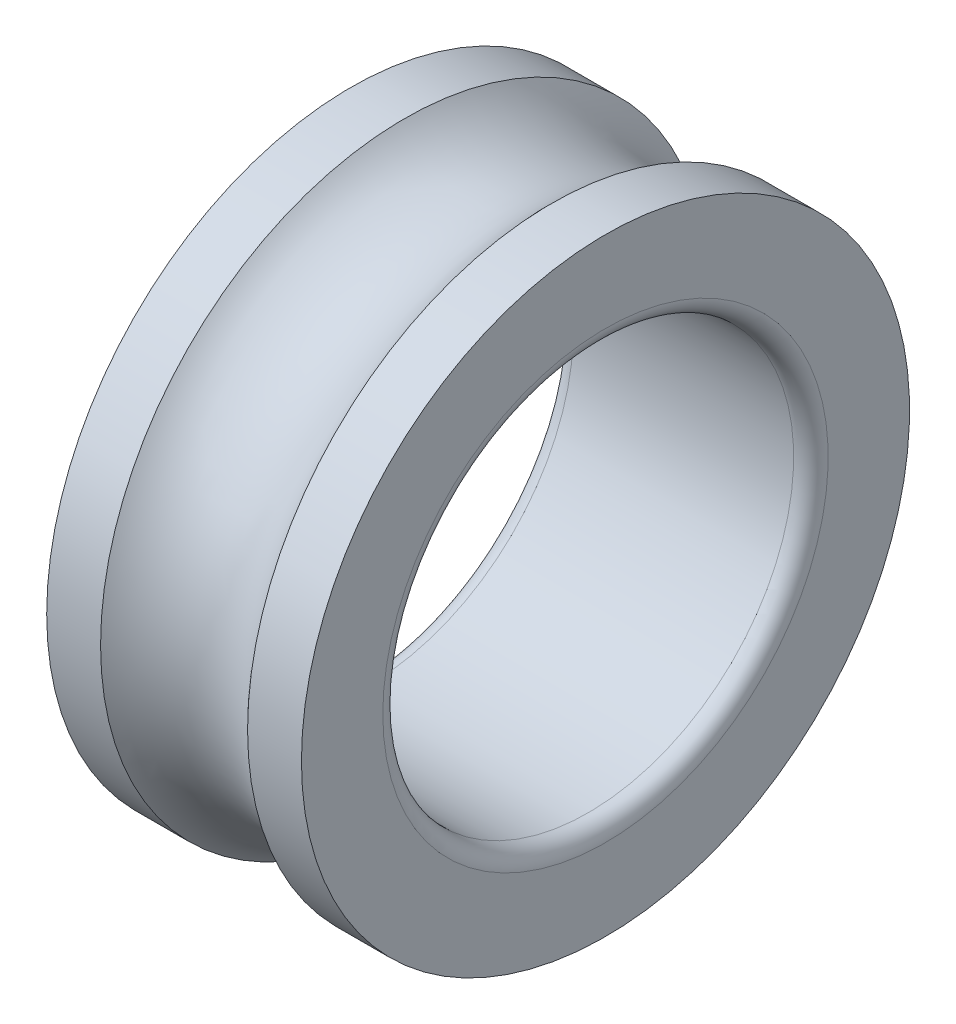
ISO-10303-21;
HEADER;
FILE_DESCRIPTION(('STEP AP214'),'2;1');
FILE_NAME('part.step','',(''),(''),'','','');
FILE_SCHEMA(('AUTOMOTIVE_DESIGN { 1 0 10303 214 1 1 1 1 }'));
ENDSEC;
DATA;
#1=APPLICATION_CONTEXT('core data for automotive mechanical design processes');
#2=APPLICATION_PROTOCOL_DEFINITION('international standard','automotive_design',2000,#1);
#3=PRODUCT_CONTEXT('',#1,'mechanical');
#4=PRODUCT('Part','Part','',(#3));
#5=PRODUCT_RELATED_PRODUCT_CATEGORY('part','',(#4));
#6=PRODUCT_DEFINITION_FORMATION('','',#4);
#7=PRODUCT_DEFINITION_CONTEXT('part definition',#1,'design');
#8=PRODUCT_DEFINITION('design','',#6,#7);
#9=PRODUCT_DEFINITION_SHAPE('','',#8);
#10=(LENGTH_UNIT() NAMED_UNIT(*) SI_UNIT(.MILLI.,.METRE.));
#11=(NAMED_UNIT(*) PLANE_ANGLE_UNIT() SI_UNIT($,.RADIAN.));
#12=(NAMED_UNIT(*) SI_UNIT($,.STERADIAN.) SOLID_ANGLE_UNIT());
#13=UNCERTAINTY_MEASURE_WITH_UNIT(LENGTH_MEASURE(1.E-05),#10,'distance_accuracy_value','');
#14=(GEOMETRIC_REPRESENTATION_CONTEXT(3) GLOBAL_UNCERTAINTY_ASSIGNED_CONTEXT((#13)) GLOBAL_UNIT_ASSIGNED_CONTEXT((#10,
#11,#12)) REPRESENTATION_CONTEXT('',''));
#15=CARTESIAN_POINT('',(0.,0.,0.));
#16=DIRECTION('',(0.,0.,1.));
#17=DIRECTION('',(1.,0.,0.));
#18=AXIS2_PLACEMENT_3D('',#15,#16,#17);
#19=CARTESIAN_POINT('',(-46.384328358209,0.,0.));
#20=DIRECTION('',(-1.,0.,0.));
#21=DIRECTION('',(0.,0.,1.));
#22=AXIS2_PLACEMENT_3D('',#19,#20,#21);
#23=CYLINDRICAL_SURFACE('',#22,37.);
#24=CARTESIAN_POINT('',(8.94427190999916,0.,0.));
#25=DIRECTION('',(-1.,0.,0.));
#26=DIRECTION('',(0.,0.,1.));
#27=AXIS2_PLACEMENT_3D('',#24,#25,#26);
#28=CIRCLE('',#27,37.);
#29=CARTESIAN_POINT('',(8.94427190999916,0.,37.));
#30=VERTEX_POINT('',#29);
#31=EDGE_CURVE('E10',#30,#30,#28,.T.);
#32=ORIENTED_EDGE('',*,*,#31,.F.);
#33=EDGE_LOOP('',(#32));
#34=FACE_BOUND('',#33,.T.);
#35=CARTESIAN_POINT('',(15.5,0.,0.));
#36=DIRECTION('',(-1.,0.,0.));
#37=DIRECTION('',(0.,0.,1.));
#38=AXIS2_PLACEMENT_3D('',#35,#36,#37);
#39=CIRCLE('',#38,37.);
#40=CARTESIAN_POINT('',(15.5,0.,37.));
#41=VERTEX_POINT('',#40);
#42=EDGE_CURVE('E74',#41,#41,#39,.T.);
#43=ORIENTED_EDGE('',*,*,#42,.T.);
#44=EDGE_LOOP('',(#43));
#45=FACE_BOUND('',#44,.T.);
#46=ADVANCED_FACE('F39',(#34,#45),#23,.T.);
#47=CARTESIAN_POINT('',(0.,0.,0.));
#48=DIRECTION('',(-1.,0.,0.));
#49=DIRECTION('',(0.,0.,1.));
#50=AXIS2_PLACEMENT_3D('',#47,#48,#49);
#51=TOROIDAL_SURFACE('',#50,45.,12.);
#52=CARTESIAN_POINT('',(-8.94427190999916,0.,0.));
#53=DIRECTION('',(-1.,0.,0.));
#54=DIRECTION('',(0.,0.,1.));
#55=AXIS2_PLACEMENT_3D('',#52,#53,#54);
#56=CIRCLE('',#55,37.);
#57=CARTESIAN_POINT('',(-8.94427190999916,0.,37.));
#58=VERTEX_POINT('',#57);
#59=EDGE_CURVE('E46',#58,#58,#56,.T.);
#60=ORIENTED_EDGE('',*,*,#59,.F.);
#61=EDGE_LOOP('',(#60));
#62=FACE_BOUND('',#61,.T.);
#63=ORIENTED_EDGE('',*,*,#31,.T.);
#64=EDGE_LOOP('',(#63));
#65=FACE_BOUND('',#64,.T.);
#66=ADVANCED_FACE('F112',(#62,#65),#51,.F.);
#67=CARTESIAN_POINT('',(-46.384328358209,0.,0.));
#68=DIRECTION('',(-1.,0.,0.));
#69=DIRECTION('',(0.,0.,1.));
#70=AXIS2_PLACEMENT_3D('',#67,#68,#69);
#71=CYLINDRICAL_SURFACE('',#70,37.);
#72=CARTESIAN_POINT('',(-15.5,0.,0.));
#73=DIRECTION('',(-1.,0.,0.));
#74=DIRECTION('',(0.,0.,1.));
#75=AXIS2_PLACEMENT_3D('',#72,#73,#74);
#76=CIRCLE('',#75,37.);
#77=CARTESIAN_POINT('',(-15.5,0.,37.));
#78=VERTEX_POINT('',#77);
#79=EDGE_CURVE('E51',#78,#78,#76,.T.);
#80=ORIENTED_EDGE('',*,*,#79,.F.);
#81=EDGE_LOOP('',(#80));
#82=FACE_BOUND('',#81,.T.);
#83=ORIENTED_EDGE('',*,*,#59,.T.);
#84=EDGE_LOOP('',(#83));
#85=FACE_BOUND('',#84,.T.);
#86=ADVANCED_FACE('F107',(#82,#85),#71,.T.);
#87=CARTESIAN_POINT('',(-15.5,27.1,0.));
#88=DIRECTION('',(1.,0.,0.));
#89=DIRECTION('',(0.,0.,-1.));
#90=AXIS2_PLACEMENT_3D('',#87,#88,#89);
#91=PLANE('',#90);
#92=CARTESIAN_POINT('',(-15.5,0.,0.));
#93=DIRECTION('',(-1.,0.,0.));
#94=DIRECTION('',(0.,0.,1.));
#95=AXIS2_PLACEMENT_3D('',#92,#93,#94);
#96=CIRCLE('',#95,27.1);
#97=CARTESIAN_POINT('',(-15.5,0.,27.1));
#98=VERTEX_POINT('',#97);
#99=EDGE_CURVE('E56',#98,#98,#96,.T.);
#100=ORIENTED_EDGE('',*,*,#99,.F.);
#101=EDGE_LOOP('',(#100));
#102=FACE_BOUND('',#101,.T.);
#103=ORIENTED_EDGE('',*,*,#79,.T.);
#104=EDGE_LOOP('',(#103));
#105=FACE_BOUND('',#104,.T.);
#106=ADVANCED_FACE('F101',(#102,#105),#91,.F.);
#107=CARTESIAN_POINT('',(-13.4,0.,0.));
#108=DIRECTION('',(-1.,0.,0.));
#109=DIRECTION('',(0.,0.,1.));
#110=AXIS2_PLACEMENT_3D('',#107,#108,#109);
#111=TOROIDAL_SURFACE('',#110,27.1,2.1);
#112=CARTESIAN_POINT('',(-13.4,0.,0.));
#113=DIRECTION('',(-1.,0.,0.));
#114=DIRECTION('',(0.,0.,1.));
#115=AXIS2_PLACEMENT_3D('',#112,#113,#114);
#116=CIRCLE('',#115,25.);
#117=CARTESIAN_POINT('',(-13.4,0.,25.));
#118=VERTEX_POINT('',#117);
#119=EDGE_CURVE('E62',#118,#118,#116,.T.);
#120=ORIENTED_EDGE('',*,*,#119,.F.);
#121=EDGE_LOOP('',(#120));
#122=FACE_BOUND('',#121,.T.);
#123=ORIENTED_EDGE('',*,*,#99,.T.);
#124=EDGE_LOOP('',(#123));
#125=FACE_BOUND('',#124,.T.);
#126=ADVANCED_FACE('F95',(#122,#125),#111,.T.);
#127=CARTESIAN_POINT('',(-46.384328358209,0.,0.));
#128=DIRECTION('',(-1.,0.,0.));
#129=DIRECTION('',(0.,0.,1.));
#130=AXIS2_PLACEMENT_3D('',#127,#128,#129);
#131=CYLINDRICAL_SURFACE('',#130,25.);
#132=CARTESIAN_POINT('',(13.4,0.,0.));
#133=DIRECTION('',(-1.,0.,0.));
#134=DIRECTION('',(0.,0.,1.));
#135=AXIS2_PLACEMENT_3D('',#132,#133,#134);
#136=CIRCLE('',#135,25.);
#137=CARTESIAN_POINT('',(13.4,0.,25.));
#138=VERTEX_POINT('',#137);
#139=EDGE_CURVE('E66',#138,#138,#136,.T.);
#140=ORIENTED_EDGE('',*,*,#139,.F.);
#141=EDGE_LOOP('',(#140));
#142=FACE_BOUND('',#141,.T.);
#143=ORIENTED_EDGE('',*,*,#119,.T.);
#144=EDGE_LOOP('',(#143));
#145=FACE_BOUND('',#144,.T.);
#146=ADVANCED_FACE('F89',(#142,#145),#131,.F.);
#147=CARTESIAN_POINT('',(13.4,0.,0.));
#148=DIRECTION('',(-1.,0.,0.));
#149=DIRECTION('',(0.,0.,1.));
#150=AXIS2_PLACEMENT_3D('',#147,#148,#149);
#151=TOROIDAL_SURFACE('',#150,27.1,2.1);
#152=CARTESIAN_POINT('',(15.5,0.,0.));
#153=DIRECTION('',(-1.,0.,0.));
#154=DIRECTION('',(0.,0.,1.));
#155=AXIS2_PLACEMENT_3D('',#152,#153,#154);
#156=CIRCLE('',#155,27.1);
#157=CARTESIAN_POINT('',(15.5,0.,27.1));
#158=VERTEX_POINT('',#157);
#159=EDGE_CURVE('E70',#158,#158,#156,.T.);
#160=ORIENTED_EDGE('',*,*,#159,.F.);
#161=EDGE_LOOP('',(#160));
#162=FACE_BOUND('',#161,.T.);
#163=ORIENTED_EDGE('',*,*,#139,.T.);
#164=EDGE_LOOP('',(#163));
#165=FACE_BOUND('',#164,.T.);
#166=ADVANCED_FACE('F83',(#162,#165),#151,.T.);
#167=CARTESIAN_POINT('',(15.5,27.1,0.));
#168=DIRECTION('',(-1.,0.,0.));
#169=DIRECTION('',(0.,0.,1.));
#170=AXIS2_PLACEMENT_3D('',#167,#168,#169);
#171=PLANE('',#170);
#172=ORIENTED_EDGE('',*,*,#42,.F.);
#173=EDGE_LOOP('',(#172));
#174=FACE_BOUND('',#173,.T.);
#175=ORIENTED_EDGE('',*,*,#159,.T.);
#176=EDGE_LOOP('',(#175));
#177=FACE_BOUND('',#176,.T.);
#178=ADVANCED_FACE('F80',(#174,#177),#171,.F.);
#179=CLOSED_SHELL('',(#46,#66,#86,#106,#126,#146,#166,#178));
#180=MANIFOLD_SOLID_BREP('B2',#179);
#181=ADVANCED_BREP_SHAPE_REPRESENTATION('',(#18,#180),#14);
#182=SHAPE_DEFINITION_REPRESENTATION(#9,#181);
ENDSEC;
END-ISO-10303-21;
